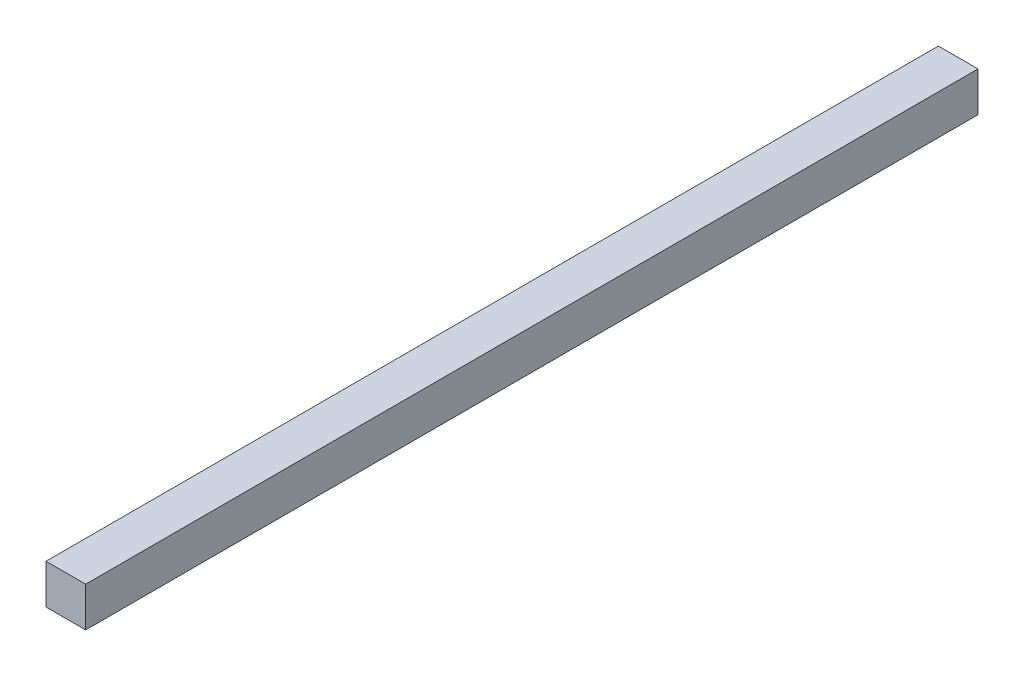
ISO-10303-21;
HEADER;
FILE_DESCRIPTION(('STEP AP214'),'2;1');
FILE_NAME('part.step','',(''),(''),'','','');
FILE_SCHEMA(('AUTOMOTIVE_DESIGN { 1 0 10303 214 1 1 1 1 }'));
ENDSEC;
DATA;
#1=APPLICATION_CONTEXT('core data for automotive mechanical design processes');
#2=APPLICATION_PROTOCOL_DEFINITION('international standard','automotive_design',2000,#1);
#3=PRODUCT_CONTEXT('',#1,'mechanical');
#4=PRODUCT('Part','Part','',(#3));
#5=PRODUCT_RELATED_PRODUCT_CATEGORY('part','',(#4));
#6=PRODUCT_DEFINITION_FORMATION('','',#4);
#7=PRODUCT_DEFINITION_CONTEXT('part definition',#1,'design');
#8=PRODUCT_DEFINITION('design','',#6,#7);
#9=PRODUCT_DEFINITION_SHAPE('','',#8);
#10=(LENGTH_UNIT() NAMED_UNIT(*) SI_UNIT(.MILLI.,.METRE.));
#11=(NAMED_UNIT(*) PLANE_ANGLE_UNIT() SI_UNIT($,.RADIAN.));
#12=(NAMED_UNIT(*) SI_UNIT($,.STERADIAN.) SOLID_ANGLE_UNIT());
#13=UNCERTAINTY_MEASURE_WITH_UNIT(LENGTH_MEASURE(1.E-05),#10,'distance_accuracy_value','');
#14=(GEOMETRIC_REPRESENTATION_CONTEXT(3) GLOBAL_UNCERTAINTY_ASSIGNED_CONTEXT((#13)) GLOBAL_UNIT_ASSIGNED_CONTEXT((#10,
#11,#12)) REPRESENTATION_CONTEXT('',''));
#15=CARTESIAN_POINT('',(0.,0.,0.));
#16=DIRECTION('',(0.,0.,1.));
#17=DIRECTION('',(1.,0.,0.));
#18=AXIS2_PLACEMENT_3D('',#15,#16,#17);
#19=CARTESIAN_POINT('',(0.,0.,57.15));
#20=DIRECTION('',(1.,0.,0.));
#21=DIRECTION('',(0.,0.,-1.));
#22=AXIS2_PLACEMENT_3D('',#19,#20,#21);
#23=PLANE('',#22);
#24=DIRECTION('',(0.,-1.,0.));
#25=VECTOR('',#24,1.);
#26=CARTESIAN_POINT('',(0.,0.,0.));
#27=LINE('',#26,#25);
#28=CARTESIAN_POINT('',(0.,2.54,0.));
#29=VERTEX_POINT('',#28);
#30=CARTESIAN_POINT('',(0.,0.,0.));
#31=VERTEX_POINT('',#30);
#32=EDGE_CURVE('E115',#29,#31,#27,.T.);
#33=ORIENTED_EDGE('',*,*,#32,.T.);
#34=DIRECTION('',(0.,0.,-1.));
#35=VECTOR('',#34,1.);
#36=CARTESIAN_POINT('',(0.,0.,57.15));
#37=LINE('',#36,#35);
#38=CARTESIAN_POINT('',(0.,0.,57.15));
#39=VERTEX_POINT('',#38);
#40=EDGE_CURVE('E11',#39,#31,#37,.T.);
#41=ORIENTED_EDGE('',*,*,#40,.F.);
#42=DIRECTION('',(0.,-1.,0.));
#43=VECTOR('',#42,1.);
#44=CARTESIAN_POINT('',(0.,0.,57.15));
#45=LINE('',#44,#43);
#46=CARTESIAN_POINT('',(0.,2.54,57.15));
#47=VERTEX_POINT('',#46);
#48=EDGE_CURVE('E99',#47,#39,#45,.T.);
#49=ORIENTED_EDGE('',*,*,#48,.F.);
#50=DIRECTION('',(0.,0.,-1.));
#51=VECTOR('',#50,1.);
#52=CARTESIAN_POINT('',(0.,2.54,57.15));
#53=LINE('',#52,#51);
#54=EDGE_CURVE('E107',#47,#29,#53,.T.);
#55=ORIENTED_EDGE('',*,*,#54,.T.);
#56=EDGE_LOOP('',(#33,#41,#49,#55));
#57=FACE_BOUND('',#56,.T.);
#58=ADVANCED_FACE('F47',(#57),#23,.F.);
#59=CARTESIAN_POINT('',(0.,0.,57.15));
#60=DIRECTION('',(0.,1.,0.));
#61=DIRECTION('',(0.,0.,1.));
#62=AXIS2_PLACEMENT_3D('',#59,#60,#61);
#63=PLANE('',#62);
#64=DIRECTION('',(1.,0.,0.));
#65=VECTOR('',#64,1.);
#66=CARTESIAN_POINT('',(0.,0.,0.));
#67=LINE('',#66,#65);
#68=CARTESIAN_POINT('',(2.54,0.,0.));
#69=VERTEX_POINT('',#68);
#70=EDGE_CURVE('E102',#31,#69,#67,.T.);
#71=ORIENTED_EDGE('',*,*,#70,.T.);
#72=DIRECTION('',(0.,0.,-1.));
#73=VECTOR('',#72,1.);
#74=CARTESIAN_POINT('',(2.54,0.,57.15));
#75=LINE('',#74,#73);
#76=CARTESIAN_POINT('',(2.54,0.,57.15));
#77=VERTEX_POINT('',#76);
#78=EDGE_CURVE('E60',#77,#69,#75,.T.);
#79=ORIENTED_EDGE('',*,*,#78,.F.);
#80=DIRECTION('',(1.,0.,0.));
#81=VECTOR('',#80,1.);
#82=CARTESIAN_POINT('',(0.,0.,57.15));
#83=LINE('',#82,#81);
#84=EDGE_CURVE('E92',#39,#77,#83,.T.);
#85=ORIENTED_EDGE('',*,*,#84,.F.);
#86=ORIENTED_EDGE('',*,*,#40,.T.);
#87=EDGE_LOOP('',(#71,#79,#85,#86));
#88=FACE_BOUND('',#87,.T.);
#89=ADVANCED_FACE('F103',(#88),#63,.F.);
#90=CARTESIAN_POINT('',(2.54,0.,57.15));
#91=DIRECTION('',(-1.,0.,0.));
#92=DIRECTION('',(0.,0.,1.));
#93=AXIS2_PLACEMENT_3D('',#90,#91,#92);
#94=PLANE('',#93);
#95=DIRECTION('',(0.,1.,0.));
#96=VECTOR('',#95,1.);
#97=CARTESIAN_POINT('',(2.54,0.,0.));
#98=LINE('',#97,#96);
#99=CARTESIAN_POINT('',(2.54,2.54,0.));
#100=VERTEX_POINT('',#99);
#101=EDGE_CURVE('E85',#69,#100,#98,.T.);
#102=ORIENTED_EDGE('',*,*,#101,.T.);
#103=DIRECTION('',(0.,0.,-1.));
#104=VECTOR('',#103,1.);
#105=CARTESIAN_POINT('',(2.54,2.54,57.15));
#106=LINE('',#105,#104);
#107=CARTESIAN_POINT('',(2.54,2.54,57.15));
#108=VERTEX_POINT('',#107);
#109=EDGE_CURVE('E104',#108,#100,#106,.T.);
#110=ORIENTED_EDGE('',*,*,#109,.F.);
#111=DIRECTION('',(0.,1.,0.));
#112=VECTOR('',#111,1.);
#113=CARTESIAN_POINT('',(2.54,0.,57.15));
#114=LINE('',#113,#112);
#115=EDGE_CURVE('E98',#77,#108,#114,.T.);
#116=ORIENTED_EDGE('',*,*,#115,.F.);
#117=ORIENTED_EDGE('',*,*,#78,.T.);
#118=EDGE_LOOP('',(#102,#110,#116,#117));
#119=FACE_BOUND('',#118,.T.);
#120=ADVANCED_FACE('F106',(#119),#94,.F.);
#121=CARTESIAN_POINT('',(0.,2.54,57.15));
#122=DIRECTION('',(0.,-1.,0.));
#123=DIRECTION('',(0.,0.,-1.));
#124=AXIS2_PLACEMENT_3D('',#121,#122,#123);
#125=PLANE('',#124);
#126=DIRECTION('',(-1.,0.,0.));
#127=VECTOR('',#126,1.);
#128=CARTESIAN_POINT('',(0.,2.54,0.));
#129=LINE('',#128,#127);
#130=EDGE_CURVE('E86',#100,#29,#129,.T.);
#131=ORIENTED_EDGE('',*,*,#130,.T.);
#132=ORIENTED_EDGE('',*,*,#54,.F.);
#133=DIRECTION('',(-1.,0.,0.));
#134=VECTOR('',#133,1.);
#135=CARTESIAN_POINT('',(0.,2.54,57.15));
#136=LINE('',#135,#134);
#137=EDGE_CURVE('E63',#108,#47,#136,.T.);
#138=ORIENTED_EDGE('',*,*,#137,.F.);
#139=ORIENTED_EDGE('',*,*,#109,.T.);
#140=EDGE_LOOP('',(#131,#132,#138,#139));
#141=FACE_BOUND('',#140,.T.);
#142=ADVANCED_FACE('F116',(#141),#125,.F.);
#143=CARTESIAN_POINT('',(0.,0.,57.15));
#144=DIRECTION('',(0.,0.,-1.));
#145=DIRECTION('',(-1.,0.,0.));
#146=AXIS2_PLACEMENT_3D('',#143,#144,#145);
#147=PLANE('',#146);
#148=ORIENTED_EDGE('',*,*,#48,.T.);
#149=ORIENTED_EDGE('',*,*,#84,.T.);
#150=ORIENTED_EDGE('',*,*,#115,.T.);
#151=ORIENTED_EDGE('',*,*,#137,.T.);
#152=EDGE_LOOP('',(#148,#149,#150,#151));
#153=FACE_BOUND('',#152,.T.);
#154=ADVANCED_FACE('F96',(#153),#147,.F.);
#155=CARTESIAN_POINT('',(0.,0.,0.));
#156=DIRECTION('',(0.,0.,-1.));
#157=DIRECTION('',(-1.,0.,0.));
#158=AXIS2_PLACEMENT_3D('',#155,#156,#157);
#159=PLANE('',#158);
#160=ORIENTED_EDGE('',*,*,#32,.F.);
#161=ORIENTED_EDGE('',*,*,#130,.F.);
#162=ORIENTED_EDGE('',*,*,#101,.F.);
#163=ORIENTED_EDGE('',*,*,#70,.F.);
#164=EDGE_LOOP('',(#160,#161,#162,#163));
#165=FACE_BOUND('',#164,.T.);
#166=ADVANCED_FACE('F125',(#165),#159,.T.);
#167=CLOSED_SHELL('',(#58,#89,#120,#142,#154,#166));
#168=MANIFOLD_SOLID_BREP('B2',#167);
#169=ADVANCED_BREP_SHAPE_REPRESENTATION('',(#18,#168),#14);
#170=SHAPE_DEFINITION_REPRESENTATION(#9,#169);
ENDSEC;
END-ISO-10303-21;
